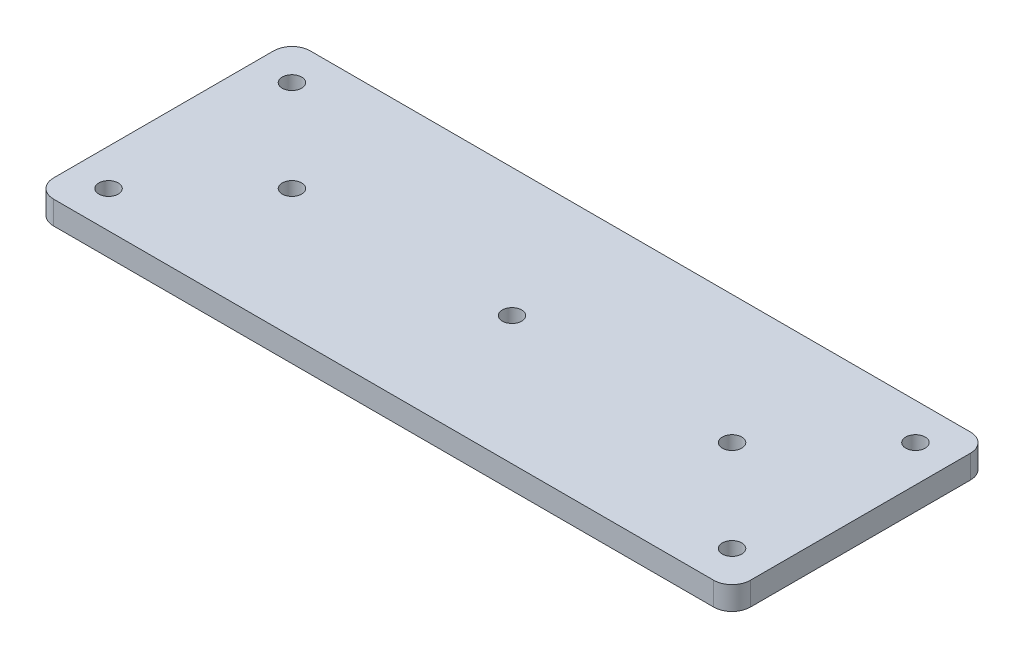
ISO-10303-21;
HEADER;
FILE_DESCRIPTION(('STEP AP214'),'2;1');
FILE_NAME('part.step','',(''),(''),'','','');
FILE_SCHEMA(('AUTOMOTIVE_DESIGN { 1 0 10303 214 1 1 1 1 }'));
ENDSEC;
DATA;
#1=APPLICATION_CONTEXT('core data for automotive mechanical design processes');
#2=APPLICATION_PROTOCOL_DEFINITION('international standard','automotive_design',2000,#1);
#3=PRODUCT_CONTEXT('',#1,'mechanical');
#4=PRODUCT('Part','Part','',(#3));
#5=PRODUCT_RELATED_PRODUCT_CATEGORY('part','',(#4));
#6=PRODUCT_DEFINITION_FORMATION('','',#4);
#7=PRODUCT_DEFINITION_CONTEXT('part definition',#1,'design');
#8=PRODUCT_DEFINITION('design','',#6,#7);
#9=PRODUCT_DEFINITION_SHAPE('','',#8);
#10=(LENGTH_UNIT() NAMED_UNIT(*) SI_UNIT(.MILLI.,.METRE.));
#11=(NAMED_UNIT(*) PLANE_ANGLE_UNIT() SI_UNIT($,.RADIAN.));
#12=(NAMED_UNIT(*) SI_UNIT($,.STERADIAN.) SOLID_ANGLE_UNIT());
#13=UNCERTAINTY_MEASURE_WITH_UNIT(LENGTH_MEASURE(1.E-05),#10,'distance_accuracy_value','');
#14=(GEOMETRIC_REPRESENTATION_CONTEXT(3) GLOBAL_UNCERTAINTY_ASSIGNED_CONTEXT((#13)) GLOBAL_UNIT_ASSIGNED_CONTEXT((#10,
#11,#12)) REPRESENTATION_CONTEXT('',''));
#15=CARTESIAN_POINT('',(0.,0.,0.));
#16=DIRECTION('',(0.,0.,1.));
#17=DIRECTION('',(1.,0.,0.));
#18=AXIS2_PLACEMENT_3D('',#15,#16,#17);
#19=CARTESIAN_POINT('',(-95.,-6.35,-35.));
#20=DIRECTION('',(-1.,0.,0.));
#21=DIRECTION('',(0.,0.,1.));
#22=AXIS2_PLACEMENT_3D('',#19,#20,#21);
#23=PLANE('',#22);
#24=DIRECTION('',(0.,0.,1.));
#25=VECTOR('',#24,1.);
#26=CARTESIAN_POINT('',(-95.,0.,-35.));
#27=LINE('',#26,#25);
#28=CARTESIAN_POINT('',(-95.,0.,-30.));
#29=VERTEX_POINT('',#28);
#30=CARTESIAN_POINT('',(-95.,0.,30.));
#31=VERTEX_POINT('',#30);
#32=EDGE_CURVE('E196',#29,#31,#27,.T.);
#33=ORIENTED_EDGE('',*,*,#32,.F.);
#34=DIRECTION('',(0.,1.,0.));
#35=VECTOR('',#34,1.);
#36=CARTESIAN_POINT('',(-95.,-6.35,-30.));
#37=LINE('',#36,#35);
#38=CARTESIAN_POINT('',(-95.,-6.35,-30.));
#39=VERTEX_POINT('',#38);
#40=EDGE_CURVE('E112',#29,#39,#37,.F.);
#41=ORIENTED_EDGE('',*,*,#40,.T.);
#42=DIRECTION('',(0.,0.,1.));
#43=VECTOR('',#42,1.);
#44=CARTESIAN_POINT('',(-95.,-6.35,-35.));
#45=LINE('',#44,#43);
#46=CARTESIAN_POINT('',(-95.,-6.35,30.));
#47=VERTEX_POINT('',#46);
#48=EDGE_CURVE('E137',#39,#47,#45,.T.);
#49=ORIENTED_EDGE('',*,*,#48,.T.);
#50=DIRECTION('',(0.,1.,0.));
#51=VECTOR('',#50,1.);
#52=CARTESIAN_POINT('',(-95.,-6.35,30.));
#53=LINE('',#52,#51);
#54=EDGE_CURVE('E118',#47,#31,#53,.T.);
#55=ORIENTED_EDGE('',*,*,#54,.T.);
#56=EDGE_LOOP('',(#33,#41,#49,#55));
#57=FACE_BOUND('',#56,.T.);
#58=ADVANCED_FACE('F39',(#57),#23,.T.);
#59=CARTESIAN_POINT('',(-95.,-6.35,-35.));
#60=DIRECTION('',(0.,0.,1.));
#61=DIRECTION('',(1.,0.,0.));
#62=AXIS2_PLACEMENT_3D('',#59,#60,#61);
#63=PLANE('',#62);
#64=DIRECTION('',(1.,0.,0.));
#65=VECTOR('',#64,1.);
#66=CARTESIAN_POINT('',(-95.,-6.35,-35.));
#67=LINE('',#66,#65);
#68=CARTESIAN_POINT('',(-90.,-6.35,-35.));
#69=VERTEX_POINT('',#68);
#70=CARTESIAN_POINT('',(90.,-6.35,-35.));
#71=VERTEX_POINT('',#70);
#72=EDGE_CURVE('E128',#69,#71,#67,.T.);
#73=ORIENTED_EDGE('',*,*,#72,.F.);
#74=DIRECTION('',(0.,1.,0.));
#75=VECTOR('',#74,1.);
#76=CARTESIAN_POINT('',(-90.,0.,-35.));
#77=LINE('',#76,#75);
#78=CARTESIAN_POINT('',(-90.,0.,-35.));
#79=VERTEX_POINT('',#78);
#80=EDGE_CURVE('E111',#69,#79,#77,.T.);
#81=ORIENTED_EDGE('',*,*,#80,.T.);
#82=DIRECTION('',(1.,0.,0.));
#83=VECTOR('',#82,1.);
#84=CARTESIAN_POINT('',(-95.,0.,-35.));
#85=LINE('',#84,#83);
#86=CARTESIAN_POINT('',(90.,0.,-35.));
#87=VERTEX_POINT('',#86);
#88=EDGE_CURVE('E125',#79,#87,#85,.T.);
#89=ORIENTED_EDGE('',*,*,#88,.T.);
#90=DIRECTION('',(0.,1.,0.));
#91=VECTOR('',#90,1.);
#92=CARTESIAN_POINT('',(90.,-6.35,-35.));
#93=LINE('',#92,#91);
#94=EDGE_CURVE('E131',#87,#71,#93,.F.);
#95=ORIENTED_EDGE('',*,*,#94,.T.);
#96=EDGE_LOOP('',(#73,#81,#89,#95));
#97=FACE_BOUND('',#96,.T.);
#98=ADVANCED_FACE('F124',(#97),#63,.F.);
#99=CARTESIAN_POINT('',(95.,-6.35,-35.));
#100=DIRECTION('',(-1.,0.,0.));
#101=DIRECTION('',(0.,0.,1.));
#102=AXIS2_PLACEMENT_3D('',#99,#100,#101);
#103=PLANE('',#102);
#104=DIRECTION('',(0.,0.,1.));
#105=VECTOR('',#104,1.);
#106=CARTESIAN_POINT('',(95.,-6.35,-35.));
#107=LINE('',#106,#105);
#108=CARTESIAN_POINT('',(95.,-6.35,-30.));
#109=VERTEX_POINT('',#108);
#110=CARTESIAN_POINT('',(95.,-6.35,30.));
#111=VERTEX_POINT('',#110);
#112=EDGE_CURVE('E184',#109,#111,#107,.T.);
#113=ORIENTED_EDGE('',*,*,#112,.F.);
#114=DIRECTION('',(0.,1.,0.));
#115=VECTOR('',#114,1.);
#116=CARTESIAN_POINT('',(95.,-6.35,-30.));
#117=LINE('',#116,#115);
#118=CARTESIAN_POINT('',(95.,0.,-30.));
#119=VERTEX_POINT('',#118);
#120=EDGE_CURVE('E11',#109,#119,#117,.T.);
#121=ORIENTED_EDGE('',*,*,#120,.T.);
#122=DIRECTION('',(0.,0.,1.));
#123=VECTOR('',#122,1.);
#124=CARTESIAN_POINT('',(95.,0.,-35.));
#125=LINE('',#124,#123);
#126=CARTESIAN_POINT('',(95.,0.,30.));
#127=VERTEX_POINT('',#126);
#128=EDGE_CURVE('E138',#119,#127,#125,.T.);
#129=ORIENTED_EDGE('',*,*,#128,.T.);
#130=DIRECTION('',(0.,1.,0.));
#131=VECTOR('',#130,1.);
#132=CARTESIAN_POINT('',(95.,-6.35,30.));
#133=LINE('',#132,#131);
#134=EDGE_CURVE('E48',#127,#111,#133,.F.);
#135=ORIENTED_EDGE('',*,*,#134,.T.);
#136=EDGE_LOOP('',(#113,#121,#129,#135));
#137=FACE_BOUND('',#136,.T.);
#138=ADVANCED_FACE('F183',(#137),#103,.F.);
#139=CARTESIAN_POINT('',(-95.,-6.35,35.));
#140=DIRECTION('',(0.,0.,1.));
#141=DIRECTION('',(1.,0.,0.));
#142=AXIS2_PLACEMENT_3D('',#139,#140,#141);
#143=PLANE('',#142);
#144=DIRECTION('',(1.,0.,0.));
#145=VECTOR('',#144,1.);
#146=CARTESIAN_POINT('',(-95.,0.,35.));
#147=LINE('',#146,#145);
#148=CARTESIAN_POINT('',(-90.,0.,35.));
#149=VERTEX_POINT('',#148);
#150=CARTESIAN_POINT('',(90.,0.,35.));
#151=VERTEX_POINT('',#150);
#152=EDGE_CURVE('E146',#149,#151,#147,.T.);
#153=ORIENTED_EDGE('',*,*,#152,.F.);
#154=DIRECTION('',(0.,1.,0.));
#155=VECTOR('',#154,1.);
#156=CARTESIAN_POINT('',(-90.,-6.35,35.));
#157=LINE('',#156,#155);
#158=CARTESIAN_POINT('',(-90.,-6.35,35.));
#159=VERTEX_POINT('',#158);
#160=EDGE_CURVE('E62',#149,#159,#157,.F.);
#161=ORIENTED_EDGE('',*,*,#160,.T.);
#162=DIRECTION('',(1.,0.,0.));
#163=VECTOR('',#162,1.);
#164=CARTESIAN_POINT('',(-95.,-6.35,35.));
#165=LINE('',#164,#163);
#166=CARTESIAN_POINT('',(90.,-6.35,35.));
#167=VERTEX_POINT('',#166);
#168=EDGE_CURVE('E143',#159,#167,#165,.T.);
#169=ORIENTED_EDGE('',*,*,#168,.T.);
#170=DIRECTION('',(0.,1.,0.));
#171=VECTOR('',#170,1.);
#172=CARTESIAN_POINT('',(90.,0.,35.));
#173=LINE('',#172,#171);
#174=EDGE_CURVE('E174',#167,#151,#173,.T.);
#175=ORIENTED_EDGE('',*,*,#174,.T.);
#176=EDGE_LOOP('',(#153,#161,#169,#175));
#177=FACE_BOUND('',#176,.T.);
#178=ADVANCED_FACE('F194',(#177),#143,.T.);
#179=CARTESIAN_POINT('',(0.,-6.35,0.));
#180=DIRECTION('',(0.,1.,0.));
#181=DIRECTION('',(0.,0.,1.));
#182=AXIS2_PLACEMENT_3D('',#179,#180,#181);
#183=PLANE('',#182);
#184=CARTESIAN_POINT('',(-85.,-6.35,-25.));
#185=DIRECTION('',(0.,1.,0.));
#186=DIRECTION('',(0.,0.,1.));
#187=AXIS2_PLACEMENT_3D('',#184,#185,#186);
#188=CIRCLE('',#187,2.64999999999999);
#189=CARTESIAN_POINT('',(-85.,-6.35,-22.35));
#190=VERTEX_POINT('',#189);
#191=EDGE_CURVE('E252',#190,#190,#188,.T.);
#192=ORIENTED_EDGE('',*,*,#191,.T.);
#193=EDGE_LOOP('',(#192));
#194=FACE_BOUND('',#193,.T.);
#195=CARTESIAN_POINT('',(-85.,-6.35,25.));
#196=DIRECTION('',(0.,1.,0.));
#197=DIRECTION('',(0.,0.,1.));
#198=AXIS2_PLACEMENT_3D('',#195,#196,#197);
#199=CIRCLE('',#198,2.64999999999999);
#200=CARTESIAN_POINT('',(-85.,-6.35,27.65));
#201=VERTEX_POINT('',#200);
#202=EDGE_CURVE('E244',#201,#201,#199,.T.);
#203=ORIENTED_EDGE('',*,*,#202,.T.);
#204=EDGE_LOOP('',(#203));
#205=FACE_BOUND('',#204,.T.);
#206=CARTESIAN_POINT('',(60.,-6.35,0.));
#207=DIRECTION('',(0.,1.,0.));
#208=DIRECTION('',(0.,0.,1.));
#209=AXIS2_PLACEMENT_3D('',#206,#207,#208);
#210=CIRCLE('',#209,2.64999999999999);
#211=CARTESIAN_POINT('',(60.,-6.35,2.64999999999997));
#212=VERTEX_POINT('',#211);
#213=EDGE_CURVE('E236',#212,#212,#210,.T.);
#214=ORIENTED_EDGE('',*,*,#213,.T.);
#215=EDGE_LOOP('',(#214));
#216=FACE_BOUND('',#215,.T.);
#217=CARTESIAN_POINT('',(85.,-6.35,-25.));
#218=DIRECTION('',(0.,1.,0.));
#219=DIRECTION('',(0.,0.,1.));
#220=AXIS2_PLACEMENT_3D('',#217,#218,#219);
#221=CIRCLE('',#220,2.64999999999999);
#222=CARTESIAN_POINT('',(85.,-6.35,-22.35));
#223=VERTEX_POINT('',#222);
#224=EDGE_CURVE('E228',#223,#223,#221,.T.);
#225=ORIENTED_EDGE('',*,*,#224,.T.);
#226=EDGE_LOOP('',(#225));
#227=FACE_BOUND('',#226,.T.);
#228=CARTESIAN_POINT('',(0.,-6.35,0.));
#229=DIRECTION('',(0.,1.,0.));
#230=DIRECTION('',(0.,0.,1.));
#231=AXIS2_PLACEMENT_3D('',#228,#229,#230);
#232=CIRCLE('',#231,2.64999999999999);
#233=CARTESIAN_POINT('',(0.,-6.35,2.64999999999999));
#234=VERTEX_POINT('',#233);
#235=EDGE_CURVE('E220',#234,#234,#232,.T.);
#236=ORIENTED_EDGE('',*,*,#235,.T.);
#237=EDGE_LOOP('',(#236));
#238=FACE_BOUND('',#237,.T.);
#239=CARTESIAN_POINT('',(-60.,-6.35,0.));
#240=DIRECTION('',(0.,1.,0.));
#241=DIRECTION('',(0.,0.,1.));
#242=AXIS2_PLACEMENT_3D('',#239,#240,#241);
#243=CIRCLE('',#242,2.64999999999999);
#244=CARTESIAN_POINT('',(-60.,-6.35,2.64999999999999));
#245=VERTEX_POINT('',#244);
#246=EDGE_CURVE('E212',#245,#245,#243,.T.);
#247=ORIENTED_EDGE('',*,*,#246,.T.);
#248=EDGE_LOOP('',(#247));
#249=FACE_BOUND('',#248,.T.);
#250=CARTESIAN_POINT('',(85.,-6.35,25.));
#251=DIRECTION('',(0.,1.,0.));
#252=DIRECTION('',(0.,0.,1.));
#253=AXIS2_PLACEMENT_3D('',#250,#251,#252);
#254=CIRCLE('',#253,2.64999999999999);
#255=CARTESIAN_POINT('',(85.,-6.35,27.65));
#256=VERTEX_POINT('',#255);
#257=EDGE_CURVE('E198',#256,#256,#254,.T.);
#258=ORIENTED_EDGE('',*,*,#257,.T.);
#259=EDGE_LOOP('',(#258));
#260=FACE_BOUND('',#259,.T.);
#261=ORIENTED_EDGE('',*,*,#48,.F.);
#262=CARTESIAN_POINT('',(-90.,-6.35,-30.));
#263=DIRECTION('',(0.,1.,0.));
#264=DIRECTION('',(0.,0.,1.));
#265=AXIS2_PLACEMENT_3D('',#262,#263,#264);
#266=CIRCLE('',#265,5.);
#267=EDGE_CURVE('E171',#39,#69,#266,.F.);
#268=ORIENTED_EDGE('',*,*,#267,.T.);
#269=ORIENTED_EDGE('',*,*,#72,.T.);
#270=CARTESIAN_POINT('',(90.,-6.35,-30.));
#271=DIRECTION('',(0.,1.,0.));
#272=DIRECTION('',(0.,0.,1.));
#273=AXIS2_PLACEMENT_3D('',#270,#271,#272);
#274=CIRCLE('',#273,5.);
#275=EDGE_CURVE('E165',#71,#109,#274,.F.);
#276=ORIENTED_EDGE('',*,*,#275,.T.);
#277=ORIENTED_EDGE('',*,*,#112,.T.);
#278=CARTESIAN_POINT('',(90.,-6.35,30.));
#279=DIRECTION('',(0.,1.,0.));
#280=DIRECTION('',(0.,0.,1.));
#281=AXIS2_PLACEMENT_3D('',#278,#279,#280);
#282=CIRCLE('',#281,5.);
#283=EDGE_CURVE('E55',#111,#167,#282,.F.);
#284=ORIENTED_EDGE('',*,*,#283,.T.);
#285=ORIENTED_EDGE('',*,*,#168,.F.);
#286=CARTESIAN_POINT('',(-90.,-6.35,30.));
#287=DIRECTION('',(0.,1.,0.));
#288=DIRECTION('',(0.,0.,1.));
#289=AXIS2_PLACEMENT_3D('',#286,#287,#288);
#290=CIRCLE('',#289,5.);
#291=EDGE_CURVE('E168',#159,#47,#290,.F.);
#292=ORIENTED_EDGE('',*,*,#291,.T.);
#293=EDGE_LOOP('',(#261,#268,#269,#276,#277,#284,#285,#292));
#294=FACE_BOUND('',#293,.T.);
#295=ADVANCED_FACE('F188',(#194,#205,#216,#227,#238,#249,#260,#294),#183,.F.);
#296=CARTESIAN_POINT('',(0.,0.,0.));
#297=DIRECTION('',(0.,1.,0.));
#298=DIRECTION('',(0.,0.,1.));
#299=AXIS2_PLACEMENT_3D('',#296,#297,#298);
#300=PLANE('',#299);
#301=CARTESIAN_POINT('',(-85.,0.,-25.));
#302=DIRECTION('',(0.,1.,0.));
#303=DIRECTION('',(0.,0.,1.));
#304=AXIS2_PLACEMENT_3D('',#301,#302,#303);
#305=CIRCLE('',#304,2.64999999999999);
#306=CARTESIAN_POINT('',(-85.,0.,-22.35));
#307=VERTEX_POINT('',#306);
#308=EDGE_CURVE('E256',#307,#307,#305,.T.);
#309=ORIENTED_EDGE('',*,*,#308,.F.);
#310=EDGE_LOOP('',(#309));
#311=FACE_BOUND('',#310,.T.);
#312=CARTESIAN_POINT('',(-85.,0.,25.));
#313=DIRECTION('',(0.,1.,0.));
#314=DIRECTION('',(0.,0.,1.));
#315=AXIS2_PLACEMENT_3D('',#312,#313,#314);
#316=CIRCLE('',#315,2.64999999999999);
#317=CARTESIAN_POINT('',(-85.,0.,27.65));
#318=VERTEX_POINT('',#317);
#319=EDGE_CURVE('E248',#318,#318,#316,.T.);
#320=ORIENTED_EDGE('',*,*,#319,.F.);
#321=EDGE_LOOP('',(#320));
#322=FACE_BOUND('',#321,.T.);
#323=CARTESIAN_POINT('',(60.,0.,0.));
#324=DIRECTION('',(0.,1.,0.));
#325=DIRECTION('',(0.,0.,1.));
#326=AXIS2_PLACEMENT_3D('',#323,#324,#325);
#327=CIRCLE('',#326,2.64999999999999);
#328=CARTESIAN_POINT('',(60.,0.,2.64999999999996));
#329=VERTEX_POINT('',#328);
#330=EDGE_CURVE('E240',#329,#329,#327,.T.);
#331=ORIENTED_EDGE('',*,*,#330,.F.);
#332=EDGE_LOOP('',(#331));
#333=FACE_BOUND('',#332,.T.);
#334=CARTESIAN_POINT('',(85.,0.,-25.));
#335=DIRECTION('',(0.,1.,0.));
#336=DIRECTION('',(0.,0.,1.));
#337=AXIS2_PLACEMENT_3D('',#334,#335,#336);
#338=CIRCLE('',#337,2.64999999999999);
#339=CARTESIAN_POINT('',(85.,0.,-22.35));
#340=VERTEX_POINT('',#339);
#341=EDGE_CURVE('E232',#340,#340,#338,.T.);
#342=ORIENTED_EDGE('',*,*,#341,.F.);
#343=EDGE_LOOP('',(#342));
#344=FACE_BOUND('',#343,.T.);
#345=CARTESIAN_POINT('',(0.,0.,0.));
#346=DIRECTION('',(0.,1.,0.));
#347=DIRECTION('',(0.,0.,1.));
#348=AXIS2_PLACEMENT_3D('',#345,#346,#347);
#349=CIRCLE('',#348,2.64999999999999);
#350=CARTESIAN_POINT('',(0.,0.,2.64999999999999));
#351=VERTEX_POINT('',#350);
#352=EDGE_CURVE('E224',#351,#351,#349,.T.);
#353=ORIENTED_EDGE('',*,*,#352,.F.);
#354=EDGE_LOOP('',(#353));
#355=FACE_BOUND('',#354,.T.);
#356=CARTESIAN_POINT('',(-60.,0.,0.));
#357=DIRECTION('',(0.,1.,0.));
#358=DIRECTION('',(0.,0.,1.));
#359=AXIS2_PLACEMENT_3D('',#356,#357,#358);
#360=CIRCLE('',#359,2.64999999999999);
#361=CARTESIAN_POINT('',(-60.,0.,2.64999999999999));
#362=VERTEX_POINT('',#361);
#363=EDGE_CURVE('E216',#362,#362,#360,.T.);
#364=ORIENTED_EDGE('',*,*,#363,.F.);
#365=EDGE_LOOP('',(#364));
#366=FACE_BOUND('',#365,.T.);
#367=CARTESIAN_POINT('',(85.,0.,25.));
#368=DIRECTION('',(0.,1.,0.));
#369=DIRECTION('',(0.,0.,1.));
#370=AXIS2_PLACEMENT_3D('',#367,#368,#369);
#371=CIRCLE('',#370,2.64999999999999);
#372=CARTESIAN_POINT('',(85.,0.,27.65));
#373=VERTEX_POINT('',#372);
#374=EDGE_CURVE('E208',#373,#373,#371,.T.);
#375=ORIENTED_EDGE('',*,*,#374,.F.);
#376=EDGE_LOOP('',(#375));
#377=FACE_BOUND('',#376,.T.);
#378=ORIENTED_EDGE('',*,*,#88,.F.);
#379=CARTESIAN_POINT('',(-90.,0.,-30.));
#380=DIRECTION('',(0.,1.,0.));
#381=DIRECTION('',(0.,0.,1.));
#382=AXIS2_PLACEMENT_3D('',#379,#380,#381);
#383=CIRCLE('',#382,5.);
#384=EDGE_CURVE('E107',#79,#29,#383,.T.);
#385=ORIENTED_EDGE('',*,*,#384,.T.);
#386=ORIENTED_EDGE('',*,*,#32,.T.);
#387=CARTESIAN_POINT('',(-90.,0.,30.));
#388=DIRECTION('',(0.,1.,0.));
#389=DIRECTION('',(0.,0.,1.));
#390=AXIS2_PLACEMENT_3D('',#387,#388,#389);
#391=CIRCLE('',#390,5.);
#392=EDGE_CURVE('E119',#31,#149,#391,.T.);
#393=ORIENTED_EDGE('',*,*,#392,.T.);
#394=ORIENTED_EDGE('',*,*,#152,.T.);
#395=CARTESIAN_POINT('',(90.,0.,30.));
#396=DIRECTION('',(0.,1.,0.));
#397=DIRECTION('',(0.,0.,1.));
#398=AXIS2_PLACEMENT_3D('',#395,#396,#397);
#399=CIRCLE('',#398,5.);
#400=EDGE_CURVE('E130',#151,#127,#399,.T.);
#401=ORIENTED_EDGE('',*,*,#400,.T.);
#402=ORIENTED_EDGE('',*,*,#128,.F.);
#403=CARTESIAN_POINT('',(90.,0.,-30.));
#404=DIRECTION('',(0.,1.,0.));
#405=DIRECTION('',(0.,0.,1.));
#406=AXIS2_PLACEMENT_3D('',#403,#404,#405);
#407=CIRCLE('',#406,5.);
#408=EDGE_CURVE('E135',#119,#87,#407,.T.);
#409=ORIENTED_EDGE('',*,*,#408,.T.);
#410=EDGE_LOOP('',(#378,#385,#386,#393,#394,#401,#402,#409));
#411=FACE_BOUND('',#410,.T.);
#412=ADVANCED_FACE('F133',(#311,#322,#333,#344,#355,#366,#377,#411),#300,.T.);
#413=CARTESIAN_POINT('',(85.,0.,25.));
#414=DIRECTION('',(0.,1.,0.));
#415=DIRECTION('',(0.,0.,1.));
#416=AXIS2_PLACEMENT_3D('',#413,#414,#415);
#417=CYLINDRICAL_SURFACE('',#416,2.64999999999999);
#418=ORIENTED_EDGE('',*,*,#257,.F.);
#419=EDGE_LOOP('',(#418));
#420=FACE_BOUND('',#419,.T.);
#421=ORIENTED_EDGE('',*,*,#374,.T.);
#422=EDGE_LOOP('',(#421));
#423=FACE_BOUND('',#422,.T.);
#424=ADVANCED_FACE('F265',(#420,#423),#417,.F.);
#425=CARTESIAN_POINT('',(-60.,0.,0.));
#426=DIRECTION('',(0.,1.,0.));
#427=DIRECTION('',(0.,0.,1.));
#428=AXIS2_PLACEMENT_3D('',#425,#426,#427);
#429=CYLINDRICAL_SURFACE('',#428,2.64999999999999);
#430=ORIENTED_EDGE('',*,*,#246,.F.);
#431=EDGE_LOOP('',(#430));
#432=FACE_BOUND('',#431,.T.);
#433=ORIENTED_EDGE('',*,*,#363,.T.);
#434=EDGE_LOOP('',(#433));
#435=FACE_BOUND('',#434,.T.);
#436=ADVANCED_FACE('F280',(#432,#435),#429,.F.);
#437=CARTESIAN_POINT('',(0.,0.,0.));
#438=DIRECTION('',(0.,1.,0.));
#439=DIRECTION('',(0.,0.,1.));
#440=AXIS2_PLACEMENT_3D('',#437,#438,#439);
#441=CYLINDRICAL_SURFACE('',#440,2.64999999999999);
#442=ORIENTED_EDGE('',*,*,#235,.F.);
#443=EDGE_LOOP('',(#442));
#444=FACE_BOUND('',#443,.T.);
#445=ORIENTED_EDGE('',*,*,#352,.T.);
#446=EDGE_LOOP('',(#445));
#447=FACE_BOUND('',#446,.T.);
#448=ADVANCED_FACE('F286',(#444,#447),#441,.F.);
#449=CARTESIAN_POINT('',(85.,0.,-25.));
#450=DIRECTION('',(0.,1.,0.));
#451=DIRECTION('',(0.,0.,1.));
#452=AXIS2_PLACEMENT_3D('',#449,#450,#451);
#453=CYLINDRICAL_SURFACE('',#452,2.64999999999999);
#454=ORIENTED_EDGE('',*,*,#224,.F.);
#455=EDGE_LOOP('',(#454));
#456=FACE_BOUND('',#455,.T.);
#457=ORIENTED_EDGE('',*,*,#341,.T.);
#458=EDGE_LOOP('',(#457));
#459=FACE_BOUND('',#458,.T.);
#460=ADVANCED_FACE('F400',(#456,#459),#453,.F.);
#461=CARTESIAN_POINT('',(60.,0.,0.));
#462=DIRECTION('',(0.,1.,0.));
#463=DIRECTION('',(0.,0.,1.));
#464=AXIS2_PLACEMENT_3D('',#461,#462,#463);
#465=CYLINDRICAL_SURFACE('',#464,2.64999999999999);
#466=ORIENTED_EDGE('',*,*,#213,.F.);
#467=EDGE_LOOP('',(#466));
#468=FACE_BOUND('',#467,.T.);
#469=ORIENTED_EDGE('',*,*,#330,.T.);
#470=EDGE_LOOP('',(#469));
#471=FACE_BOUND('',#470,.T.);
#472=ADVANCED_FACE('F390',(#468,#471),#465,.F.);
#473=CARTESIAN_POINT('',(-85.,0.,25.));
#474=DIRECTION('',(0.,1.,0.));
#475=DIRECTION('',(0.,0.,1.));
#476=AXIS2_PLACEMENT_3D('',#473,#474,#475);
#477=CYLINDRICAL_SURFACE('',#476,2.64999999999999);
#478=ORIENTED_EDGE('',*,*,#202,.F.);
#479=EDGE_LOOP('',(#478));
#480=FACE_BOUND('',#479,.T.);
#481=ORIENTED_EDGE('',*,*,#319,.T.);
#482=EDGE_LOOP('',(#481));
#483=FACE_BOUND('',#482,.T.);
#484=ADVANCED_FACE('F380',(#480,#483),#477,.F.);
#485=CARTESIAN_POINT('',(-85.,0.,-25.));
#486=DIRECTION('',(0.,1.,0.));
#487=DIRECTION('',(0.,0.,1.));
#488=AXIS2_PLACEMENT_3D('',#485,#486,#487);
#489=CYLINDRICAL_SURFACE('',#488,2.64999999999999);
#490=ORIENTED_EDGE('',*,*,#191,.F.);
#491=EDGE_LOOP('',(#490));
#492=FACE_BOUND('',#491,.T.);
#493=ORIENTED_EDGE('',*,*,#308,.T.);
#494=EDGE_LOOP('',(#493));
#495=FACE_BOUND('',#494,.T.);
#496=ADVANCED_FACE('F261',(#492,#495),#489,.F.);
#497=CARTESIAN_POINT('',(-90.,-6.35,-30.));
#498=DIRECTION('',(0.,-1.,0.));
#499=DIRECTION('',(0.,0.,-1.));
#500=AXIS2_PLACEMENT_3D('',#497,#498,#499);
#501=CYLINDRICAL_SURFACE('',#500,5.);
#502=ORIENTED_EDGE('',*,*,#267,.F.);
#503=ORIENTED_EDGE('',*,*,#40,.F.);
#504=ORIENTED_EDGE('',*,*,#384,.F.);
#505=ORIENTED_EDGE('',*,*,#80,.F.);
#506=EDGE_LOOP('',(#502,#503,#504,#505));
#507=FACE_BOUND('',#506,.T.);
#508=ADVANCED_FACE('F110',(#507),#501,.T.);
#509=CARTESIAN_POINT('',(-90.,-6.35,30.));
#510=DIRECTION('',(0.,1.,0.));
#511=DIRECTION('',(0.,0.,1.));
#512=AXIS2_PLACEMENT_3D('',#509,#510,#511);
#513=CYLINDRICAL_SURFACE('',#512,5.);
#514=ORIENTED_EDGE('',*,*,#291,.F.);
#515=ORIENTED_EDGE('',*,*,#160,.F.);
#516=ORIENTED_EDGE('',*,*,#392,.F.);
#517=ORIENTED_EDGE('',*,*,#54,.F.);
#518=EDGE_LOOP('',(#514,#515,#516,#517));
#519=FACE_BOUND('',#518,.T.);
#520=ADVANCED_FACE('F303',(#519),#513,.T.);
#521=CARTESIAN_POINT('',(90.,-6.35,-30.));
#522=DIRECTION('',(0.,1.,0.));
#523=DIRECTION('',(0.,0.,1.));
#524=AXIS2_PLACEMENT_3D('',#521,#522,#523);
#525=CYLINDRICAL_SURFACE('',#524,5.);
#526=ORIENTED_EDGE('',*,*,#275,.F.);
#527=ORIENTED_EDGE('',*,*,#94,.F.);
#528=ORIENTED_EDGE('',*,*,#408,.F.);
#529=ORIENTED_EDGE('',*,*,#120,.F.);
#530=EDGE_LOOP('',(#526,#527,#528,#529));
#531=FACE_BOUND('',#530,.T.);
#532=ADVANCED_FACE('F305',(#531),#525,.T.);
#533=CARTESIAN_POINT('',(90.,-6.35,30.));
#534=DIRECTION('',(0.,-1.,0.));
#535=DIRECTION('',(0.,0.,-1.));
#536=AXIS2_PLACEMENT_3D('',#533,#534,#535);
#537=CYLINDRICAL_SURFACE('',#536,5.);
#538=ORIENTED_EDGE('',*,*,#283,.F.);
#539=ORIENTED_EDGE('',*,*,#134,.F.);
#540=ORIENTED_EDGE('',*,*,#400,.F.);
#541=ORIENTED_EDGE('',*,*,#174,.F.);
#542=EDGE_LOOP('',(#538,#539,#540,#541));
#543=FACE_BOUND('',#542,.T.);
#544=ADVANCED_FACE('F41',(#543),#537,.T.);
#545=CLOSED_SHELL('',(#58,#98,#138,#178,#295,#412,#424,#436,#448,#460,#472,#484,#496,#508,#520,
#532,#544));
#546=MANIFOLD_SOLID_BREP('B2',#545);
#547=ADVANCED_BREP_SHAPE_REPRESENTATION('',(#18,#546),#14);
#548=SHAPE_DEFINITION_REPRESENTATION(#9,#547);
ENDSEC;
END-ISO-10303-21;
